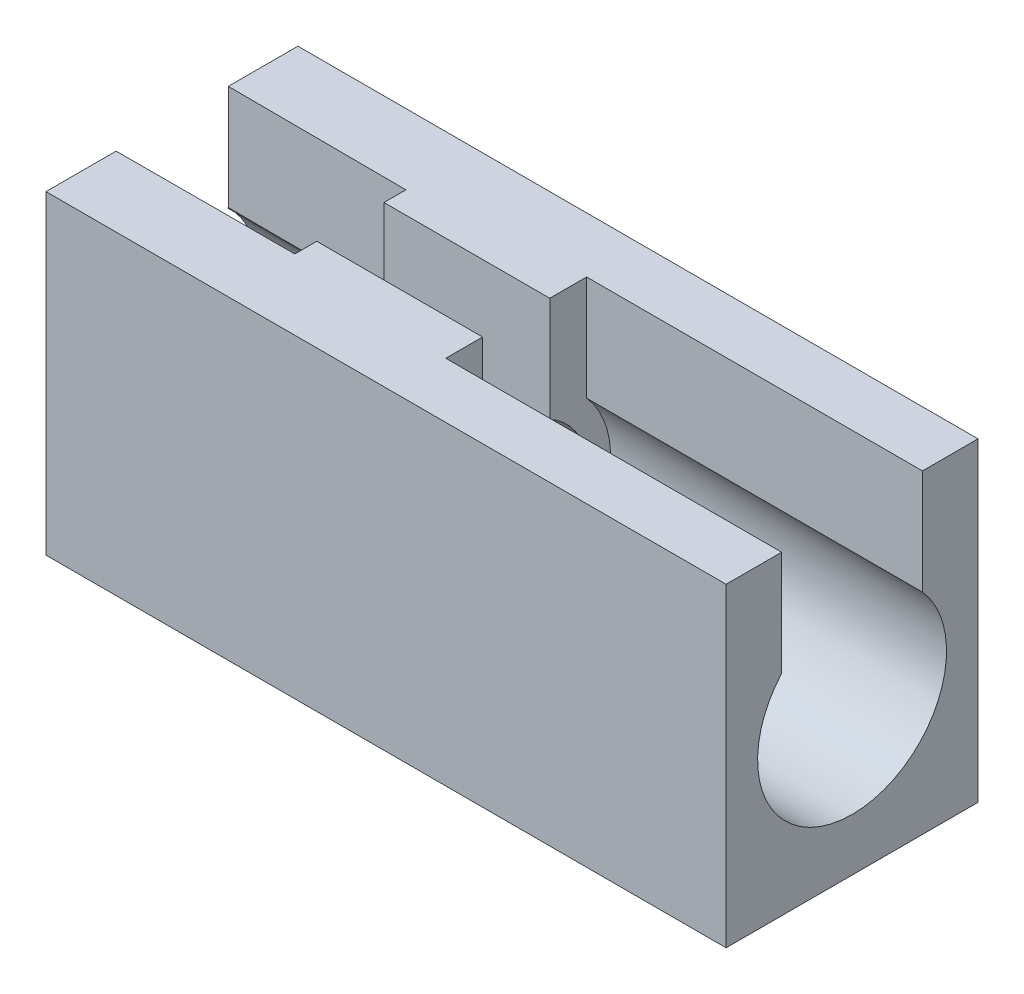
ISO-10303-21;
HEADER;
FILE_DESCRIPTION(('STEP AP214'),'2;1');
FILE_NAME('part.step','',(''),(''),'','','');
FILE_SCHEMA(('AUTOMOTIVE_DESIGN { 1 0 10303 214 1 1 1 1 }'));
ENDSEC;
DATA;
#1=APPLICATION_CONTEXT('core data for automotive mechanical design processes');
#2=APPLICATION_PROTOCOL_DEFINITION('international standard','automotive_design',2000,#1);
#3=PRODUCT_CONTEXT('',#1,'mechanical');
#4=PRODUCT('Part','Part','',(#3));
#5=PRODUCT_RELATED_PRODUCT_CATEGORY('part','',(#4));
#6=PRODUCT_DEFINITION_FORMATION('','',#4);
#7=PRODUCT_DEFINITION_CONTEXT('part definition',#1,'design');
#8=PRODUCT_DEFINITION('design','',#6,#7);
#9=PRODUCT_DEFINITION_SHAPE('','',#8);
#10=(LENGTH_UNIT() NAMED_UNIT(*) SI_UNIT(.MILLI.,.METRE.));
#11=(NAMED_UNIT(*) PLANE_ANGLE_UNIT() SI_UNIT($,.RADIAN.));
#12=(NAMED_UNIT(*) SI_UNIT($,.STERADIAN.) SOLID_ANGLE_UNIT());
#13=UNCERTAINTY_MEASURE_WITH_UNIT(LENGTH_MEASURE(1.E-05),#10,'distance_accuracy_value','');
#14=(GEOMETRIC_REPRESENTATION_CONTEXT(3) GLOBAL_UNCERTAINTY_ASSIGNED_CONTEXT((#13)) GLOBAL_UNIT_ASSIGNED_CONTEXT((#10,
#11,#12)) REPRESENTATION_CONTEXT('',''));
#15=CARTESIAN_POINT('',(0.,0.,0.));
#16=DIRECTION('',(0.,0.,1.));
#17=DIRECTION('',(1.,0.,0.));
#18=AXIS2_PLACEMENT_3D('',#15,#16,#17);
#19=CARTESIAN_POINT('',(0.,10.,0.));
#20=DIRECTION('',(0.,1.,0.));
#21=DIRECTION('',(0.,0.,1.));
#22=AXIS2_PLACEMENT_3D('',#19,#20,#21);
#23=PLANE('',#22);
#24=DIRECTION('',(0.,0.,1.));
#25=VECTOR('',#24,1.);
#26=CARTESIAN_POINT('',(-16.2,10.,-6.));
#27=LINE('',#26,#25);
#28=CARTESIAN_POINT('',(-16.2,10.,2.64575131106459));
#29=VERTEX_POINT('',#28);
#30=CARTESIAN_POINT('',(-16.2,10.,2.66067520780666));
#31=VERTEX_POINT('',#30);
#32=EDGE_CURVE('E242',#29,#31,#27,.T.);
#33=ORIENTED_EDGE('',*,*,#32,.T.);
#34=DIRECTION('',(-0.999998458670041,0.,0.00175574985169672));
#35=VECTOR('',#34,1.);
#36=CARTESIAN_POINT('',(-7.7,10.,2.64575131106459));
#37=LINE('',#36,#35);
#38=CARTESIAN_POINT('',(-7.7,10.,2.64575131106459));
#39=VERTEX_POINT('',#38);
#40=EDGE_CURVE('E174',#39,#31,#37,.T.);
#41=ORIENTED_EDGE('',*,*,#40,.F.);
#42=DIRECTION('',(-1.,0.,0.));
#43=VECTOR('',#42,1.);
#44=CARTESIAN_POINT('',(-7.7,10.,2.64575131106459));
#45=LINE('',#44,#43);
#46=EDGE_CURVE('E258',#29,#39,#45,.F.);
#47=ORIENTED_EDGE('',*,*,#46,.F.);
#48=EDGE_LOOP('',(#33,#41,#47));
#49=FACE_BOUND('',#48,.T.);
#50=ADVANCED_FACE('F33',(#49),#23,.T.);
#51=DIRECTION('',(-1.,0.,0.));
#52=VECTOR('',#51,1.);
#53=CARTESIAN_POINT('',(-7.7,10.,-2.64575131106459));
#54=LINE('',#53,#52);
#55=CARTESIAN_POINT('',(-7.7,10.,-2.64575131106459));
#56=VERTEX_POINT('',#55);
#57=CARTESIAN_POINT('',(-16.2,10.,-2.64575131106459));
#58=VERTEX_POINT('',#57);
#59=EDGE_CURVE('E261',#56,#58,#54,.T.);
#60=ORIENTED_EDGE('',*,*,#59,.F.);
#61=DIRECTION('',(0.999989079372191,0.,0.00467345015565165));
#62=VECTOR('',#61,1.);
#63=CARTESIAN_POINT('',(-16.2,10.,-2.68547607120695));
#64=LINE('',#63,#62);
#65=CARTESIAN_POINT('',(-16.2,10.,-2.68547607120695));
#66=VERTEX_POINT('',#65);
#67=EDGE_CURVE('E179',#66,#56,#64,.T.);
#68=ORIENTED_EDGE('',*,*,#67,.F.);
#69=EDGE_CURVE('E239',#66,#58,#27,.T.);
#70=ORIENTED_EDGE('',*,*,#69,.T.);
#71=EDGE_LOOP('',(#60,#68,#70));
#72=FACE_BOUND('',#71,.T.);
#73=ADVANCED_FACE('F321',(#72),#23,.T.);
#74=CARTESIAN_POINT('',(-16.2,15.,-3.35410196624967));
#75=DIRECTION('',(0.,0.,-1.));
#76=DIRECTION('',(-1.,0.,0.));
#77=AXIS2_PLACEMENT_3D('',#74,#75,#76);
#78=PLANE('',#77);
#79=DIRECTION('',(0.,-1.,0.));
#80=VECTOR('',#79,1.);
#81=CARTESIAN_POINT('',(0.199999999999993,15.,-3.35410196624968));
#82=LINE('',#81,#80);
#83=CARTESIAN_POINT('',(0.199999999065202,15.,-3.3541019662502));
#84=VERTEX_POINT('',#83);
#85=CARTESIAN_POINT('',(0.199999999999993,10.,-3.35410196624968));
#86=VERTEX_POINT('',#85);
#87=EDGE_CURVE('E48',#84,#86,#82,.T.);
#88=ORIENTED_EDGE('',*,*,#87,.T.);
#89=DIRECTION('',(1.,0.,0.));
#90=VECTOR('',#89,1.);
#91=CARTESIAN_POINT('',(0.199999999999993,10.,-3.35410196624968));
#92=LINE('',#91,#90);
#93=CARTESIAN_POINT('',(16.2,10.,-3.35410196624967));
#94=VERTEX_POINT('',#93);
#95=EDGE_CURVE('E41',#94,#86,#92,.F.);
#96=ORIENTED_EDGE('',*,*,#95,.F.);
#97=DIRECTION('',(0.,-1.,0.));
#98=VECTOR('',#97,1.);
#99=CARTESIAN_POINT('',(16.2,15.,-3.35410196624967));
#100=LINE('',#99,#98);
#101=CARTESIAN_POINT('',(16.2,15.,-3.35410196624967));
#102=VERTEX_POINT('',#101);
#103=EDGE_CURVE('E216',#102,#94,#100,.T.);
#104=ORIENTED_EDGE('',*,*,#103,.F.);
#105=DIRECTION('',(1.,0.,0.));
#106=VECTOR('',#105,1.);
#107=CARTESIAN_POINT('',(-16.2,15.,-3.35410196624967));
#108=LINE('',#107,#106);
#109=EDGE_CURVE('E208',#84,#102,#108,.T.);
#110=ORIENTED_EDGE('',*,*,#109,.F.);
#111=EDGE_LOOP('',(#88,#96,#104,#110));
#112=FACE_BOUND('',#111,.T.);
#113=ADVANCED_FACE('F348',(#112),#78,.F.);
#114=CARTESIAN_POINT('',(16.2,10.,-6.));
#115=DIRECTION('',(-1.,0.,0.));
#116=DIRECTION('',(0.,0.,1.));
#117=AXIS2_PLACEMENT_3D('',#114,#115,#116);
#118=PLANE('',#117);
#119=DIRECTION('',(0.,-1.,0.));
#120=VECTOR('',#119,1.);
#121=CARTESIAN_POINT('',(16.2,10.,-6.));
#122=LINE('',#121,#120);
#123=CARTESIAN_POINT('',(16.2,15.,-6.00000000000011));
#124=VERTEX_POINT('',#123);
#125=CARTESIAN_POINT('',(16.2,0.,-6.));
#126=VERTEX_POINT('',#125);
#127=EDGE_CURVE('E255',#124,#126,#122,.T.);
#128=ORIENTED_EDGE('',*,*,#127,.F.);
#129=DIRECTION('',(0.,0.,-1.));
#130=VECTOR('',#129,1.);
#131=CARTESIAN_POINT('',(16.2,15.,-6.00000000000011));
#132=LINE('',#131,#130);
#133=EDGE_CURVE('E210',#102,#124,#132,.T.);
#134=ORIENTED_EDGE('',*,*,#133,.F.);
#135=ORIENTED_EDGE('',*,*,#103,.T.);
#136=CARTESIAN_POINT('',(16.2,7.,0.));
#137=DIRECTION('',(1.,0.,0.));
#138=DIRECTION('',(0.,0.,-1.));
#139=AXIS2_PLACEMENT_3D('',#136,#137,#138);
#140=CIRCLE('',#139,4.5);
#141=CARTESIAN_POINT('',(16.2,10.,3.35410196624969));
#142=VERTEX_POINT('',#141);
#143=EDGE_CURVE('E219',#142,#94,#140,.T.);
#144=ORIENTED_EDGE('',*,*,#143,.F.);
#145=DIRECTION('',(0.,-1.,0.));
#146=VECTOR('',#145,1.);
#147=CARTESIAN_POINT('',(16.2,15.,3.35410196624969));
#148=LINE('',#147,#146);
#149=CARTESIAN_POINT('',(16.2,15.,3.35410196624969));
#150=VERTEX_POINT('',#149);
#151=EDGE_CURVE('E180',#150,#142,#148,.T.);
#152=ORIENTED_EDGE('',*,*,#151,.F.);
#153=DIRECTION('',(0.,0.,-1.));
#154=VECTOR('',#153,1.);
#155=CARTESIAN_POINT('',(16.2,15.,6.));
#156=LINE('',#155,#154);
#157=CARTESIAN_POINT('',(16.2,15.,6.));
#158=VERTEX_POINT('',#157);
#159=EDGE_CURVE('E296',#158,#150,#156,.T.);
#160=ORIENTED_EDGE('',*,*,#159,.F.);
#161=DIRECTION('',(0.,-1.,0.));
#162=VECTOR('',#161,1.);
#163=CARTESIAN_POINT('',(16.2,10.,6.));
#164=LINE('',#163,#162);
#165=CARTESIAN_POINT('',(16.2,0.,6.));
#166=VERTEX_POINT('',#165);
#167=EDGE_CURVE('E241',#158,#166,#164,.T.);
#168=ORIENTED_EDGE('',*,*,#167,.T.);
#169=DIRECTION('',(0.,0.,-1.));
#170=VECTOR('',#169,1.);
#171=CARTESIAN_POINT('',(16.2,0.,-6.));
#172=LINE('',#171,#170);
#173=EDGE_CURVE('E237',#166,#126,#172,.T.);
#174=ORIENTED_EDGE('',*,*,#173,.T.);
#175=EDGE_LOOP('',(#128,#134,#135,#144,#152,#160,#168,#174));
#176=FACE_BOUND('',#175,.T.);
#177=ADVANCED_FACE('F35',(#176),#118,.F.);
#178=CARTESIAN_POINT('',(-16.2,10.,-6.));
#179=DIRECTION('',(0.,0.,1.));
#180=DIRECTION('',(1.,0.,0.));
#181=AXIS2_PLACEMENT_3D('',#178,#179,#180);
#182=PLANE('',#181);
#183=DIRECTION('',(-1.,0.,0.));
#184=VECTOR('',#183,1.);
#185=CARTESIAN_POINT('',(-16.2,0.,-6.));
#186=LINE('',#185,#184);
#187=CARTESIAN_POINT('',(-16.2,0.,-6.));
#188=VERTEX_POINT('',#187);
#189=EDGE_CURVE('E245',#126,#188,#186,.T.);
#190=ORIENTED_EDGE('',*,*,#189,.T.);
#191=DIRECTION('',(0.,-1.,0.));
#192=VECTOR('',#191,1.);
#193=CARTESIAN_POINT('',(-16.2,10.,-6.));
#194=LINE('',#193,#192);
#195=CARTESIAN_POINT('',(-16.2,15.,-6.00000000000011));
#196=VERTEX_POINT('',#195);
#197=EDGE_CURVE('E252',#196,#188,#194,.T.);
#198=ORIENTED_EDGE('',*,*,#197,.F.);
#199=DIRECTION('',(-1.,0.,0.));
#200=VECTOR('',#199,1.);
#201=CARTESIAN_POINT('',(-16.2,15.,-6.00000000000011));
#202=LINE('',#201,#200);
#203=EDGE_CURVE('E213',#124,#196,#202,.T.);
#204=ORIENTED_EDGE('',*,*,#203,.F.);
#205=ORIENTED_EDGE('',*,*,#127,.T.);
#206=EDGE_LOOP('',(#190,#198,#204,#205));
#207=FACE_BOUND('',#206,.T.);
#208=ADVANCED_FACE('F340',(#207),#182,.F.);
#209=CARTESIAN_POINT('',(-16.2,10.,-6.));
#210=DIRECTION('',(1.,0.,0.));
#211=DIRECTION('',(0.,0.,-1.));
#212=AXIS2_PLACEMENT_3D('',#209,#210,#211);
#213=PLANE('',#212);
#214=DIRECTION('',(0.,-1.,0.));
#215=VECTOR('',#214,1.);
#216=CARTESIAN_POINT('',(-16.2,15.,-2.68547607120695));
#217=LINE('',#216,#215);
#218=CARTESIAN_POINT('',(-16.2,15.,-2.68547607120695));
#219=VERTEX_POINT('',#218);
#220=EDGE_CURVE('E204',#219,#66,#217,.T.);
#221=ORIENTED_EDGE('',*,*,#220,.F.);
#222=DIRECTION('',(0.,0.,1.));
#223=VECTOR('',#222,1.);
#224=CARTESIAN_POINT('',(-16.2,15.,-6.00000000000011));
#225=LINE('',#224,#223);
#226=EDGE_CURVE('E206',#196,#219,#225,.T.);
#227=ORIENTED_EDGE('',*,*,#226,.F.);
#228=ORIENTED_EDGE('',*,*,#197,.T.);
#229=DIRECTION('',(0.,0.,1.));
#230=VECTOR('',#229,1.);
#231=CARTESIAN_POINT('',(-16.2,0.,-6.));
#232=LINE('',#231,#230);
#233=CARTESIAN_POINT('',(-16.2,0.,6.));
#234=VERTEX_POINT('',#233);
#235=EDGE_CURVE('E247',#188,#234,#232,.T.);
#236=ORIENTED_EDGE('',*,*,#235,.T.);
#237=DIRECTION('',(0.,-1.,0.));
#238=VECTOR('',#237,1.);
#239=CARTESIAN_POINT('',(-16.2,10.,6.));
#240=LINE('',#239,#238);
#241=CARTESIAN_POINT('',(-16.2,15.,6.00000000000011));
#242=VERTEX_POINT('',#241);
#243=EDGE_CURVE('E161',#242,#234,#240,.T.);
#244=ORIENTED_EDGE('',*,*,#243,.F.);
#245=DIRECTION('',(0.,0.,1.));
#246=VECTOR('',#245,1.);
#247=CARTESIAN_POINT('',(-16.2,15.,2.66067520780666));
#248=LINE('',#247,#246);
#249=CARTESIAN_POINT('',(-16.2,15.,2.66067520780666));
#250=VERTEX_POINT('',#249);
#251=EDGE_CURVE('E153',#250,#242,#248,.T.);
#252=ORIENTED_EDGE('',*,*,#251,.F.);
#253=DIRECTION('',(0.,-1.,0.));
#254=VECTOR('',#253,1.);
#255=CARTESIAN_POINT('',(-16.2,15.,2.66067520780666));
#256=LINE('',#255,#254);
#257=EDGE_CURVE('E159',#250,#31,#256,.T.);
#258=ORIENTED_EDGE('',*,*,#257,.T.);
#259=ORIENTED_EDGE('',*,*,#32,.F.);
#260=CARTESIAN_POINT('',(-16.2,7.,0.));
#261=DIRECTION('',(-1.,0.,0.));
#262=DIRECTION('',(0.,0.,1.));
#263=AXIS2_PLACEMENT_3D('',#260,#261,#262);
#264=CIRCLE('',#263,4.);
#265=EDGE_CURVE('E233',#58,#29,#264,.T.);
#266=ORIENTED_EDGE('',*,*,#265,.F.);
#267=ORIENTED_EDGE('',*,*,#69,.F.);
#268=EDGE_LOOP('',(#221,#227,#228,#236,#244,#252,#258,#259,#266,#267));
#269=FACE_BOUND('',#268,.T.);
#270=ADVANCED_FACE('F156',(#269),#213,.F.);
#271=CARTESIAN_POINT('',(-16.2,10.,6.));
#272=DIRECTION('',(0.,0.,-1.));
#273=DIRECTION('',(-1.,0.,0.));
#274=AXIS2_PLACEMENT_3D('',#271,#272,#273);
#275=PLANE('',#274);
#276=DIRECTION('',(1.,0.,0.));
#277=VECTOR('',#276,1.);
#278=CARTESIAN_POINT('',(-16.2,0.,6.));
#279=LINE('',#278,#277);
#280=EDGE_CURVE('E56',#234,#166,#279,.T.);
#281=ORIENTED_EDGE('',*,*,#280,.T.);
#282=ORIENTED_EDGE('',*,*,#167,.F.);
#283=DIRECTION('',(1.,0.,0.));
#284=VECTOR('',#283,1.);
#285=CARTESIAN_POINT('',(-16.2,15.,6.00000000000011));
#286=LINE('',#285,#284);
#287=EDGE_CURVE('E165',#242,#158,#286,.T.);
#288=ORIENTED_EDGE('',*,*,#287,.F.);
#289=ORIENTED_EDGE('',*,*,#243,.T.);
#290=EDGE_LOOP('',(#281,#282,#288,#289));
#291=FACE_BOUND('',#290,.T.);
#292=ADVANCED_FACE('F346',(#291),#275,.F.);
#293=CARTESIAN_POINT('',(0.,0.,0.));
#294=DIRECTION('',(0.,1.,0.));
#295=DIRECTION('',(0.,0.,1.));
#296=AXIS2_PLACEMENT_3D('',#293,#294,#295);
#297=PLANE('',#296);
#298=ORIENTED_EDGE('',*,*,#173,.F.);
#299=ORIENTED_EDGE('',*,*,#280,.F.);
#300=ORIENTED_EDGE('',*,*,#235,.F.);
#301=ORIENTED_EDGE('',*,*,#189,.F.);
#302=EDGE_LOOP('',(#298,#299,#300,#301));
#303=FACE_BOUND('',#302,.T.);
#304=ADVANCED_FACE('F337',(#303),#297,.F.);
#305=CARTESIAN_POINT('',(-7.7,7.,0.));
#306=DIRECTION('',(-1.,0.,0.));
#307=DIRECTION('',(0.,0.,1.));
#308=AXIS2_PLACEMENT_3D('',#305,#306,#307);
#309=CYLINDRICAL_SURFACE('',#308,4.);
#310=ORIENTED_EDGE('',*,*,#59,.T.);
#311=ORIENTED_EDGE('',*,*,#265,.T.);
#312=ORIENTED_EDGE('',*,*,#46,.T.);
#313=CARTESIAN_POINT('',(-7.7,7.,0.));
#314=DIRECTION('',(-1.,0.,0.));
#315=DIRECTION('',(0.,0.,1.));
#316=AXIS2_PLACEMENT_3D('',#313,#314,#315);
#317=CIRCLE('',#316,4.);
#318=EDGE_CURVE('E234',#56,#39,#317,.T.);
#319=ORIENTED_EDGE('',*,*,#318,.F.);
#320=EDGE_LOOP('',(#310,#311,#312,#319));
#321=FACE_BOUND('',#320,.T.);
#322=ADVANCED_FACE('F317',(#321),#309,.F.);
#323=CARTESIAN_POINT('',(-7.7,7.,0.));
#324=DIRECTION('',(-1.,0.,0.));
#325=DIRECTION('',(0.,0.,1.));
#326=AXIS2_PLACEMENT_3D('',#323,#324,#325);
#327=PLANE('',#326);
#328=CARTESIAN_POINT('',(-7.7,7.,0.));
#329=DIRECTION('',(-1.,0.,0.));
#330=DIRECTION('',(0.,0.,1.));
#331=AXIS2_PLACEMENT_3D('',#328,#329,#330);
#332=CIRCLE('',#331,3.4);
#333=CARTESIAN_POINT('',(-7.7,10.,-1.6));
#334=VERTEX_POINT('',#333);
#335=CARTESIAN_POINT('',(-7.7,10.,1.6));
#336=VERTEX_POINT('',#335);
#337=EDGE_CURVE('E264',#334,#336,#332,.T.);
#338=ORIENTED_EDGE('',*,*,#337,.F.);
#339=DIRECTION('',(0.,-1.,0.));
#340=VECTOR('',#339,1.);
#341=CARTESIAN_POINT('',(-7.7,15.,-1.6));
#342=LINE('',#341,#340);
#343=CARTESIAN_POINT('',(-7.7,15.,-1.6));
#344=VERTEX_POINT('',#343);
#345=EDGE_CURVE('E199',#344,#334,#342,.T.);
#346=ORIENTED_EDGE('',*,*,#345,.F.);
#347=DIRECTION('',(0.,0.,1.));
#348=VECTOR('',#347,1.);
#349=CARTESIAN_POINT('',(-7.7,15.,-2.64575131106459));
#350=LINE('',#349,#348);
#351=CARTESIAN_POINT('',(-7.7,15.,-2.64575131106459));
#352=VERTEX_POINT('',#351);
#353=EDGE_CURVE('E189',#352,#344,#350,.T.);
#354=ORIENTED_EDGE('',*,*,#353,.F.);
#355=DIRECTION('',(0.,-1.,0.));
#356=VECTOR('',#355,1.);
#357=CARTESIAN_POINT('',(-7.7,15.,-2.64575131106459));
#358=LINE('',#357,#356);
#359=EDGE_CURVE('E201',#352,#56,#358,.T.);
#360=ORIENTED_EDGE('',*,*,#359,.T.);
#361=ORIENTED_EDGE('',*,*,#318,.T.);
#362=DIRECTION('',(0.,-1.,0.));
#363=VECTOR('',#362,1.);
#364=CARTESIAN_POINT('',(-7.7,15.,2.64575131106459));
#365=LINE('',#364,#363);
#366=CARTESIAN_POINT('',(-7.7,15.,2.64575131106459));
#367=VERTEX_POINT('',#366);
#368=EDGE_CURVE('E287',#367,#39,#365,.T.);
#369=ORIENTED_EDGE('',*,*,#368,.F.);
#370=DIRECTION('',(0.,0.,1.));
#371=VECTOR('',#370,1.);
#372=CARTESIAN_POINT('',(-7.7,15.,1.6));
#373=LINE('',#372,#371);
#374=CARTESIAN_POINT('',(-7.7,15.,1.6));
#375=VERTEX_POINT('',#374);
#376=EDGE_CURVE('E171',#375,#367,#373,.T.);
#377=ORIENTED_EDGE('',*,*,#376,.F.);
#378=DIRECTION('',(0.,-1.,0.));
#379=VECTOR('',#378,1.);
#380=CARTESIAN_POINT('',(-7.7,15.,1.6));
#381=LINE('',#380,#379);
#382=EDGE_CURVE('E282',#375,#336,#381,.T.);
#383=ORIENTED_EDGE('',*,*,#382,.T.);
#384=EDGE_LOOP('',(#338,#346,#354,#360,#361,#369,#377,#383));
#385=FACE_BOUND('',#384,.T.);
#386=ADVANCED_FACE('F310',(#385),#327,.T.);
#387=CARTESIAN_POINT('',(0.199999999999999,7.,0.));
#388=DIRECTION('',(-1.,0.,0.));
#389=DIRECTION('',(0.,0.,1.));
#390=AXIS2_PLACEMENT_3D('',#387,#388,#389);
#391=CYLINDRICAL_SURFACE('',#390,3.4);
#392=DIRECTION('',(-1.,0.,0.));
#393=VECTOR('',#392,1.);
#394=CARTESIAN_POINT('',(0.199999999999999,10.,-1.6));
#395=LINE('',#394,#393);
#396=CARTESIAN_POINT('',(0.199999999999992,10.,-1.6));
#397=VERTEX_POINT('',#396);
#398=EDGE_CURVE('E230',#397,#334,#395,.T.);
#399=ORIENTED_EDGE('',*,*,#398,.T.);
#400=ORIENTED_EDGE('',*,*,#337,.T.);
#401=DIRECTION('',(-1.,0.,0.));
#402=VECTOR('',#401,1.);
#403=CARTESIAN_POINT('',(0.199999999999999,10.,1.6));
#404=LINE('',#403,#402);
#405=CARTESIAN_POINT('',(0.199999999999991,10.,1.6));
#406=VERTEX_POINT('',#405);
#407=EDGE_CURVE('E227',#336,#406,#404,.F.);
#408=ORIENTED_EDGE('',*,*,#407,.T.);
#409=CARTESIAN_POINT('',(0.199999999999999,7.,0.));
#410=DIRECTION('',(-1.,0.,0.));
#411=DIRECTION('',(0.,0.,1.));
#412=AXIS2_PLACEMENT_3D('',#409,#410,#411);
#413=CIRCLE('',#412,3.4);
#414=EDGE_CURVE('E222',#397,#406,#413,.T.);
#415=ORIENTED_EDGE('',*,*,#414,.F.);
#416=EDGE_LOOP('',(#399,#400,#408,#415));
#417=FACE_BOUND('',#416,.T.);
#418=ADVANCED_FACE('F373',(#417),#391,.F.);
#419=CARTESIAN_POINT('',(0.199999999999992,7.,0.));
#420=DIRECTION('',(1.,0.,0.));
#421=DIRECTION('',(0.,0.,-1.));
#422=AXIS2_PLACEMENT_3D('',#419,#420,#421);
#423=PLANE('',#422);
#424=CARTESIAN_POINT('',(0.199999999999992,7.,0.));
#425=DIRECTION('',(1.,0.,0.));
#426=DIRECTION('',(0.,0.,-1.));
#427=AXIS2_PLACEMENT_3D('',#424,#425,#426);
#428=CIRCLE('',#427,4.5);
#429=CARTESIAN_POINT('',(0.199999999999991,10.,3.35410196624969));
#430=VERTEX_POINT('',#429);
#431=EDGE_CURVE('E220',#430,#86,#428,.T.);
#432=ORIENTED_EDGE('',*,*,#431,.T.);
#433=ORIENTED_EDGE('',*,*,#87,.F.);
#434=DIRECTION('',(0.,0.,-1.));
#435=VECTOR('',#434,1.);
#436=CARTESIAN_POINT('',(0.199999999999992,15.,-1.6));
#437=LINE('',#436,#435);
#438=CARTESIAN_POINT('',(0.199999999999992,15.,-1.6));
#439=VERTEX_POINT('',#438);
#440=EDGE_CURVE('E193',#439,#84,#437,.T.);
#441=ORIENTED_EDGE('',*,*,#440,.F.);
#442=DIRECTION('',(0.,-1.,0.));
#443=VECTOR('',#442,1.);
#444=CARTESIAN_POINT('',(0.199999999999992,15.,-1.6));
#445=LINE('',#444,#443);
#446=EDGE_CURVE('E196',#439,#397,#445,.T.);
#447=ORIENTED_EDGE('',*,*,#446,.T.);
#448=ORIENTED_EDGE('',*,*,#414,.T.);
#449=DIRECTION('',(0.,-1.,0.));
#450=VECTOR('',#449,1.);
#451=CARTESIAN_POINT('',(0.199999999999991,15.,1.6));
#452=LINE('',#451,#450);
#453=CARTESIAN_POINT('',(0.199999999999991,15.,1.6));
#454=VERTEX_POINT('',#453);
#455=EDGE_CURVE('E281',#454,#406,#452,.T.);
#456=ORIENTED_EDGE('',*,*,#455,.F.);
#457=DIRECTION('',(0.,0.,-1.));
#458=VECTOR('',#457,1.);
#459=CARTESIAN_POINT('',(0.199999999999991,15.,3.35410196624969));
#460=LINE('',#459,#458);
#461=CARTESIAN_POINT('',(0.199999999999991,15.,3.35410196624969));
#462=VERTEX_POINT('',#461);
#463=EDGE_CURVE('E278',#462,#454,#460,.T.);
#464=ORIENTED_EDGE('',*,*,#463,.F.);
#465=DIRECTION('',(0.,-1.,0.));
#466=VECTOR('',#465,1.);
#467=CARTESIAN_POINT('',(0.199999999999991,15.,3.35410196624969));
#468=LINE('',#467,#466);
#469=EDGE_CURVE('E184',#462,#430,#468,.T.);
#470=ORIENTED_EDGE('',*,*,#469,.T.);
#471=EDGE_LOOP('',(#432,#433,#441,#447,#448,#456,#464,#470));
#472=FACE_BOUND('',#471,.T.);
#473=ADVANCED_FACE('F274',(#472),#423,.T.);
#474=CARTESIAN_POINT('',(0.199999999999992,7.,0.));
#475=DIRECTION('',(1.,0.,0.));
#476=DIRECTION('',(0.,0.,-1.));
#477=AXIS2_PLACEMENT_3D('',#474,#475,#476);
#478=CYLINDRICAL_SURFACE('',#477,4.5);
#479=DIRECTION('',(1.,0.,0.));
#480=VECTOR('',#479,1.);
#481=CARTESIAN_POINT('',(0.199999999999991,10.,3.35410196624969));
#482=LINE('',#481,#480);
#483=EDGE_CURVE('E11',#430,#142,#482,.T.);
#484=ORIENTED_EDGE('',*,*,#483,.T.);
#485=ORIENTED_EDGE('',*,*,#143,.T.);
#486=ORIENTED_EDGE('',*,*,#95,.T.);
#487=ORIENTED_EDGE('',*,*,#431,.F.);
#488=EDGE_LOOP('',(#484,#485,#486,#487));
#489=FACE_BOUND('',#488,.T.);
#490=ADVANCED_FACE('F269',(#489),#478,.F.);
#491=CARTESIAN_POINT('',(0.,15.,0.));
#492=DIRECTION('',(0.,1.,0.));
#493=DIRECTION('',(0.,0.,1.));
#494=AXIS2_PLACEMENT_3D('',#491,#492,#493);
#495=PLANE('',#494);
#496=ORIENTED_EDGE('',*,*,#226,.T.);
#497=DIRECTION('',(0.999989079372191,0.,0.00467345015565165));
#498=VECTOR('',#497,1.);
#499=CARTESIAN_POINT('',(-16.2,15.,-2.68547607120695));
#500=LINE('',#499,#498);
#501=EDGE_CURVE('E182',#219,#352,#500,.T.);
#502=ORIENTED_EDGE('',*,*,#501,.T.);
#503=ORIENTED_EDGE('',*,*,#353,.T.);
#504=DIRECTION('',(1.,0.,0.));
#505=VECTOR('',#504,1.);
#506=CARTESIAN_POINT('',(-7.7,15.,-1.6));
#507=LINE('',#506,#505);
#508=EDGE_CURVE('E191',#344,#439,#507,.T.);
#509=ORIENTED_EDGE('',*,*,#508,.T.);
#510=ORIENTED_EDGE('',*,*,#440,.T.);
#511=ORIENTED_EDGE('',*,*,#109,.T.);
#512=ORIENTED_EDGE('',*,*,#133,.T.);
#513=ORIENTED_EDGE('',*,*,#203,.T.);
#514=EDGE_LOOP('',(#496,#502,#503,#509,#510,#511,#512,#513));
#515=FACE_BOUND('',#514,.T.);
#516=ADVANCED_FACE('F330',(#515),#495,.T.);
#517=CARTESIAN_POINT('',(-16.2,15.,-2.68547607120695));
#518=DIRECTION('',(0.00467345015565165,0.,-0.999989079372191));
#519=DIRECTION('',(-0.999989079372191,0.,-0.00467345015565165));
#520=AXIS2_PLACEMENT_3D('',#517,#518,#519);
#521=PLANE('',#520);
#522=ORIENTED_EDGE('',*,*,#67,.T.);
#523=ORIENTED_EDGE('',*,*,#359,.F.);
#524=ORIENTED_EDGE('',*,*,#501,.F.);
#525=ORIENTED_EDGE('',*,*,#220,.T.);
#526=EDGE_LOOP('',(#522,#523,#524,#525));
#527=FACE_BOUND('',#526,.T.);
#528=ADVANCED_FACE('F324',(#527),#521,.F.);
#529=CARTESIAN_POINT('',(-7.7,15.,-1.6));
#530=DIRECTION('',(0.,0.,-1.));
#531=DIRECTION('',(-1.,0.,0.));
#532=AXIS2_PLACEMENT_3D('',#529,#530,#531);
#533=PLANE('',#532);
#534=ORIENTED_EDGE('',*,*,#398,.F.);
#535=ORIENTED_EDGE('',*,*,#446,.F.);
#536=ORIENTED_EDGE('',*,*,#508,.F.);
#537=ORIENTED_EDGE('',*,*,#345,.T.);
#538=EDGE_LOOP('',(#534,#535,#536,#537));
#539=FACE_BOUND('',#538,.T.);
#540=ADVANCED_FACE('F394',(#539),#533,.F.);
#541=CARTESIAN_POINT('',(-7.7,15.,2.64575131106459));
#542=DIRECTION('',(0.00175574985169672,0.,0.999998458670041));
#543=DIRECTION('',(0.999998458670041,0.,-0.00175574985169672));
#544=AXIS2_PLACEMENT_3D('',#541,#542,#543);
#545=PLANE('',#544);
#546=ORIENTED_EDGE('',*,*,#40,.T.);
#547=ORIENTED_EDGE('',*,*,#257,.F.);
#548=DIRECTION('',(-0.999998458670041,0.,0.00175574985169672));
#549=VECTOR('',#548,1.);
#550=CARTESIAN_POINT('',(-7.7,15.,2.64575131106459));
#551=LINE('',#550,#549);
#552=EDGE_CURVE('E166',#367,#250,#551,.T.);
#553=ORIENTED_EDGE('',*,*,#552,.F.);
#554=ORIENTED_EDGE('',*,*,#368,.T.);
#555=EDGE_LOOP('',(#546,#547,#553,#554));
#556=FACE_BOUND('',#555,.T.);
#557=ADVANCED_FACE('F176',(#556),#545,.F.);
#558=CARTESIAN_POINT('',(16.2,15.,3.35410196624969));
#559=DIRECTION('',(0.,0.,1.));
#560=DIRECTION('',(1.,0.,0.));
#561=AXIS2_PLACEMENT_3D('',#558,#559,#560);
#562=PLANE('',#561);
#563=ORIENTED_EDGE('',*,*,#483,.F.);
#564=ORIENTED_EDGE('',*,*,#469,.F.);
#565=DIRECTION('',(-1.,0.,0.));
#566=VECTOR('',#565,1.);
#567=CARTESIAN_POINT('',(16.2,15.,3.35410196624969));
#568=LINE('',#567,#566);
#569=EDGE_CURVE('E294',#150,#462,#568,.T.);
#570=ORIENTED_EDGE('',*,*,#569,.F.);
#571=ORIENTED_EDGE('',*,*,#151,.T.);
#572=EDGE_LOOP('',(#563,#564,#570,#571));
#573=FACE_BOUND('',#572,.T.);
#574=ADVANCED_FACE('F302',(#573),#562,.F.);
#575=CARTESIAN_POINT('',(0.199999999999991,15.,1.6));
#576=DIRECTION('',(0.,0.,1.));
#577=DIRECTION('',(1.,0.,0.));
#578=AXIS2_PLACEMENT_3D('',#575,#576,#577);
#579=PLANE('',#578);
#580=ORIENTED_EDGE('',*,*,#407,.F.);
#581=ORIENTED_EDGE('',*,*,#382,.F.);
#582=DIRECTION('',(-1.,0.,0.));
#583=VECTOR('',#582,1.);
#584=CARTESIAN_POINT('',(0.199999999999991,15.,1.6));
#585=LINE('',#584,#583);
#586=EDGE_CURVE('E291',#454,#375,#585,.T.);
#587=ORIENTED_EDGE('',*,*,#586,.F.);
#588=ORIENTED_EDGE('',*,*,#455,.T.);
#589=EDGE_LOOP('',(#580,#581,#587,#588));
#590=FACE_BOUND('',#589,.T.);
#591=ADVANCED_FACE('F307',(#590),#579,.F.);
#592=CARTESIAN_POINT('',(0.,15.,0.));
#593=DIRECTION('',(0.,1.,0.));
#594=DIRECTION('',(0.,0.,1.));
#595=AXIS2_PLACEMENT_3D('',#592,#593,#594);
#596=PLANE('',#595);
#597=ORIENTED_EDGE('',*,*,#552,.T.);
#598=ORIENTED_EDGE('',*,*,#251,.T.);
#599=ORIENTED_EDGE('',*,*,#287,.T.);
#600=ORIENTED_EDGE('',*,*,#159,.T.);
#601=ORIENTED_EDGE('',*,*,#569,.T.);
#602=ORIENTED_EDGE('',*,*,#463,.T.);
#603=ORIENTED_EDGE('',*,*,#586,.T.);
#604=ORIENTED_EDGE('',*,*,#376,.T.);
#605=EDGE_LOOP('',(#597,#598,#599,#600,#601,#602,#603,#604));
#606=FACE_BOUND('',#605,.T.);
#607=ADVANCED_FACE('F169',(#606),#596,.T.);
#608=CLOSED_SHELL('',(#50,#73,#113,#177,#208,#270,#292,#304,#322,#386,#418,#473,#490,#516,#528,
#540,#557,#574,#591,#607));
#609=MANIFOLD_SOLID_BREP('B2',#608);
#610=ADVANCED_BREP_SHAPE_REPRESENTATION('',(#18,#609),#14);
#611=SHAPE_DEFINITION_REPRESENTATION(#9,#610);
ENDSEC;
END-ISO-10303-21;
